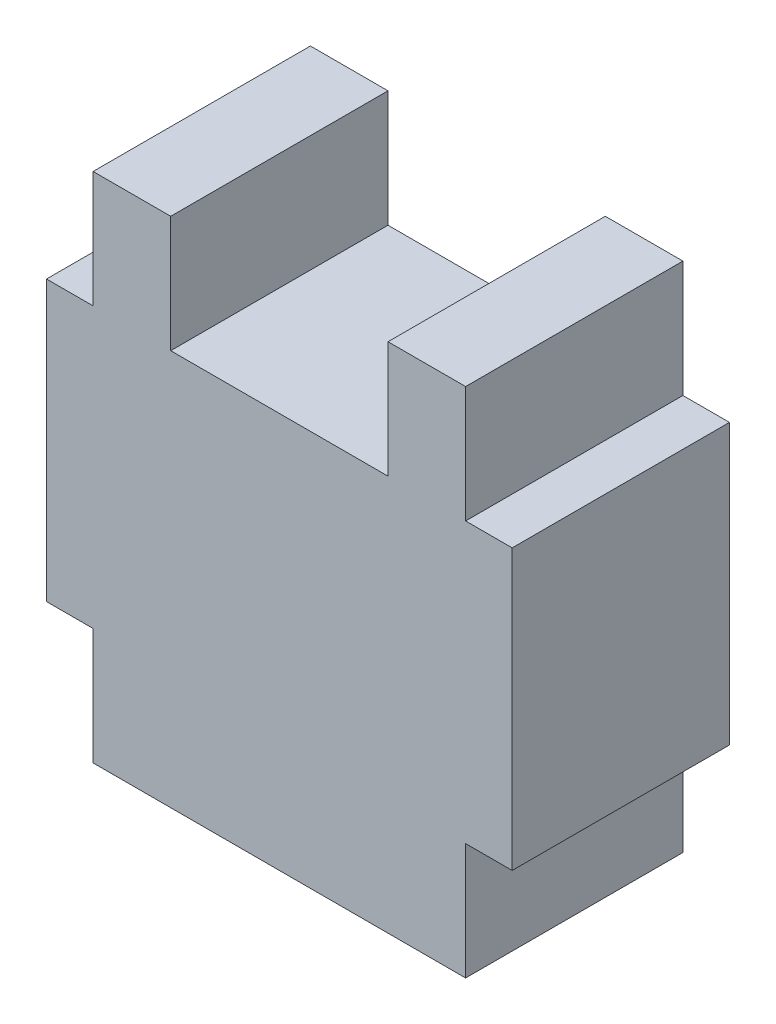
ISO-10303-21;
HEADER;
FILE_DESCRIPTION(('STEP AP214'),'2;1');
FILE_NAME('part.step','',(''),(''),'','','');
FILE_SCHEMA(('AUTOMOTIVE_DESIGN { 1 0 10303 214 1 1 1 1 }'));
ENDSEC;
DATA;
#1=APPLICATION_CONTEXT('core data for automotive mechanical design processes');
#2=APPLICATION_PROTOCOL_DEFINITION('international standard','automotive_design',2000,#1);
#3=PRODUCT_CONTEXT('',#1,'mechanical');
#4=PRODUCT('Part','Part','',(#3));
#5=PRODUCT_RELATED_PRODUCT_CATEGORY('part','',(#4));
#6=PRODUCT_DEFINITION_FORMATION('','',#4);
#7=PRODUCT_DEFINITION_CONTEXT('part definition',#1,'design');
#8=PRODUCT_DEFINITION('design','',#6,#7);
#9=PRODUCT_DEFINITION_SHAPE('','',#8);
#10=(LENGTH_UNIT() NAMED_UNIT(*) SI_UNIT(.MILLI.,.METRE.));
#11=(NAMED_UNIT(*) PLANE_ANGLE_UNIT() SI_UNIT($,.RADIAN.));
#12=(NAMED_UNIT(*) SI_UNIT($,.STERADIAN.) SOLID_ANGLE_UNIT());
#13=UNCERTAINTY_MEASURE_WITH_UNIT(LENGTH_MEASURE(1.E-05),#10,'distance_accuracy_value','');
#14=(GEOMETRIC_REPRESENTATION_CONTEXT(3) GLOBAL_UNCERTAINTY_ASSIGNED_CONTEXT((#13)) GLOBAL_UNIT_ASSIGNED_CONTEXT((#10,
#11,#12)) REPRESENTATION_CONTEXT('',''));
#15=CARTESIAN_POINT('',(0.,0.,0.));
#16=DIRECTION('',(0.,0.,1.));
#17=DIRECTION('',(1.,0.,0.));
#18=AXIS2_PLACEMENT_3D('',#15,#16,#17);
#19=CARTESIAN_POINT('',(1.2,-1.65,1.4));
#20=DIRECTION('',(0.,1.,0.));
#21=DIRECTION('',(0.,0.,1.));
#22=AXIS2_PLACEMENT_3D('',#19,#20,#21);
#23=PLANE('',#22);
#24=DIRECTION('',(1.,0.,0.));
#25=VECTOR('',#24,1.);
#26=CARTESIAN_POINT('',(1.2,-1.65,0.));
#27=LINE('',#26,#25);
#28=CARTESIAN_POINT('',(-1.2,-1.65,0.));
#29=VERTEX_POINT('',#28);
#30=CARTESIAN_POINT('',(1.2,-1.65,0.));
#31=VERTEX_POINT('',#30);
#32=EDGE_CURVE('E178',#29,#31,#27,.T.);
#33=ORIENTED_EDGE('',*,*,#32,.T.);
#34=DIRECTION('',(0.,0.,-1.));
#35=VECTOR('',#34,1.);
#36=CARTESIAN_POINT('',(1.2,-1.65,1.4));
#37=LINE('',#36,#35);
#38=CARTESIAN_POINT('',(1.2,-1.65,1.4));
#39=VERTEX_POINT('',#38);
#40=EDGE_CURVE('E11',#39,#31,#37,.T.);
#41=ORIENTED_EDGE('',*,*,#40,.F.);
#42=DIRECTION('',(1.,0.,0.));
#43=VECTOR('',#42,1.);
#44=CARTESIAN_POINT('',(1.2,-1.65,1.4));
#45=LINE('',#44,#43);
#46=CARTESIAN_POINT('',(-1.2,-1.65,1.4));
#47=VERTEX_POINT('',#46);
#48=EDGE_CURVE('E208',#47,#39,#45,.T.);
#49=ORIENTED_EDGE('',*,*,#48,.F.);
#50=DIRECTION('',(0.,0.,-1.));
#51=VECTOR('',#50,1.);
#52=CARTESIAN_POINT('',(-1.2,-1.65,1.4));
#53=LINE('',#52,#51);
#54=EDGE_CURVE('E174',#47,#29,#53,.T.);
#55=ORIENTED_EDGE('',*,*,#54,.T.);
#56=EDGE_LOOP('',(#33,#41,#49,#55));
#57=FACE_BOUND('',#56,.T.);
#58=ADVANCED_FACE('F34',(#57),#23,.F.);
#59=CARTESIAN_POINT('',(1.2,-0.9,1.4));
#60=DIRECTION('',(-1.,0.,0.));
#61=DIRECTION('',(0.,0.,1.));
#62=AXIS2_PLACEMENT_3D('',#59,#60,#61);
#63=PLANE('',#62);
#64=DIRECTION('',(0.,1.,0.));
#65=VECTOR('',#64,1.);
#66=CARTESIAN_POINT('',(1.2,-0.9,0.));
#67=LINE('',#66,#65);
#68=CARTESIAN_POINT('',(1.2,-0.9,0.));
#69=VERTEX_POINT('',#68);
#70=EDGE_CURVE('E181',#31,#69,#67,.T.);
#71=ORIENTED_EDGE('',*,*,#70,.T.);
#72=DIRECTION('',(0.,0.,-1.));
#73=VECTOR('',#72,1.);
#74=CARTESIAN_POINT('',(1.2,-0.9,1.4));
#75=LINE('',#74,#73);
#76=CARTESIAN_POINT('',(1.2,-0.9,1.4));
#77=VERTEX_POINT('',#76);
#78=EDGE_CURVE('E42',#77,#69,#75,.T.);
#79=ORIENTED_EDGE('',*,*,#78,.F.);
#80=DIRECTION('',(0.,1.,0.));
#81=VECTOR('',#80,1.);
#82=CARTESIAN_POINT('',(1.2,-0.9,1.4));
#83=LINE('',#82,#81);
#84=EDGE_CURVE('E117',#39,#77,#83,.T.);
#85=ORIENTED_EDGE('',*,*,#84,.F.);
#86=ORIENTED_EDGE('',*,*,#40,.T.);
#87=EDGE_LOOP('',(#71,#79,#85,#86));
#88=FACE_BOUND('',#87,.T.);
#89=ADVANCED_FACE('F306',(#88),#63,.F.);
#90=CARTESIAN_POINT('',(1.5,-0.9,1.4));
#91=DIRECTION('',(0.,1.,0.));
#92=DIRECTION('',(0.,0.,1.));
#93=AXIS2_PLACEMENT_3D('',#90,#91,#92);
#94=PLANE('',#93);
#95=DIRECTION('',(1.,0.,0.));
#96=VECTOR('',#95,1.);
#97=CARTESIAN_POINT('',(1.5,-0.9,0.));
#98=LINE('',#97,#96);
#99=CARTESIAN_POINT('',(1.5,-0.9,0.));
#100=VERTEX_POINT('',#99);
#101=EDGE_CURVE('E183',#69,#100,#98,.T.);
#102=ORIENTED_EDGE('',*,*,#101,.T.);
#103=DIRECTION('',(0.,0.,-1.));
#104=VECTOR('',#103,1.);
#105=CARTESIAN_POINT('',(1.5,-0.9,1.4));
#106=LINE('',#105,#104);
#107=CARTESIAN_POINT('',(1.5,-0.9,1.4));
#108=VERTEX_POINT('',#107);
#109=EDGE_CURVE('E239',#108,#100,#106,.T.);
#110=ORIENTED_EDGE('',*,*,#109,.F.);
#111=DIRECTION('',(1.,0.,0.));
#112=VECTOR('',#111,1.);
#113=CARTESIAN_POINT('',(1.5,-0.9,1.4));
#114=LINE('',#113,#112);
#115=EDGE_CURVE('E247',#77,#108,#114,.T.);
#116=ORIENTED_EDGE('',*,*,#115,.F.);
#117=ORIENTED_EDGE('',*,*,#78,.T.);
#118=EDGE_LOOP('',(#102,#110,#116,#117));
#119=FACE_BOUND('',#118,.T.);
#120=ADVANCED_FACE('F245',(#119),#94,.F.);
#121=CARTESIAN_POINT('',(1.5,0.9,1.4));
#122=DIRECTION('',(-1.,0.,0.));
#123=DIRECTION('',(0.,0.,1.));
#124=AXIS2_PLACEMENT_3D('',#121,#122,#123);
#125=PLANE('',#124);
#126=DIRECTION('',(0.,1.,0.));
#127=VECTOR('',#126,1.);
#128=CARTESIAN_POINT('',(1.5,0.9,0.));
#129=LINE('',#128,#127);
#130=CARTESIAN_POINT('',(1.5,0.9,0.));
#131=VERTEX_POINT('',#130);
#132=EDGE_CURVE('E185',#100,#131,#129,.T.);
#133=ORIENTED_EDGE('',*,*,#132,.T.);
#134=DIRECTION('',(0.,0.,-1.));
#135=VECTOR('',#134,1.);
#136=CARTESIAN_POINT('',(1.5,0.9,1.4));
#137=LINE('',#136,#135);
#138=CARTESIAN_POINT('',(1.5,0.9,1.4));
#139=VERTEX_POINT('',#138);
#140=EDGE_CURVE('E236',#139,#131,#137,.T.);
#141=ORIENTED_EDGE('',*,*,#140,.F.);
#142=DIRECTION('',(0.,1.,0.));
#143=VECTOR('',#142,1.);
#144=CARTESIAN_POINT('',(1.5,0.9,1.4));
#145=LINE('',#144,#143);
#146=EDGE_CURVE('E265',#108,#139,#145,.T.);
#147=ORIENTED_EDGE('',*,*,#146,.F.);
#148=ORIENTED_EDGE('',*,*,#109,.T.);
#149=EDGE_LOOP('',(#133,#141,#147,#148));
#150=FACE_BOUND('',#149,.T.);
#151=ADVANCED_FACE('F256',(#150),#125,.F.);
#152=CARTESIAN_POINT('',(1.2,0.9,1.4));
#153=DIRECTION('',(0.,-1.,0.));
#154=DIRECTION('',(0.,0.,-1.));
#155=AXIS2_PLACEMENT_3D('',#152,#153,#154);
#156=PLANE('',#155);
#157=DIRECTION('',(-1.,0.,0.));
#158=VECTOR('',#157,1.);
#159=CARTESIAN_POINT('',(1.2,0.9,0.));
#160=LINE('',#159,#158);
#161=CARTESIAN_POINT('',(1.2,0.9,0.));
#162=VERTEX_POINT('',#161);
#163=EDGE_CURVE('E187',#131,#162,#160,.T.);
#164=ORIENTED_EDGE('',*,*,#163,.T.);
#165=DIRECTION('',(0.,0.,-1.));
#166=VECTOR('',#165,1.);
#167=CARTESIAN_POINT('',(1.2,0.9,1.4));
#168=LINE('',#167,#166);
#169=CARTESIAN_POINT('',(1.2,0.9,1.4));
#170=VERTEX_POINT('',#169);
#171=EDGE_CURVE('E233',#170,#162,#168,.T.);
#172=ORIENTED_EDGE('',*,*,#171,.F.);
#173=DIRECTION('',(-1.,0.,0.));
#174=VECTOR('',#173,1.);
#175=CARTESIAN_POINT('',(1.2,0.9,1.4));
#176=LINE('',#175,#174);
#177=EDGE_CURVE('E262',#139,#170,#176,.T.);
#178=ORIENTED_EDGE('',*,*,#177,.F.);
#179=ORIENTED_EDGE('',*,*,#140,.T.);
#180=EDGE_LOOP('',(#164,#172,#178,#179));
#181=FACE_BOUND('',#180,.T.);
#182=ADVANCED_FACE('F260',(#181),#156,.F.);
#183=CARTESIAN_POINT('',(1.2,1.65,1.4));
#184=DIRECTION('',(-1.,0.,0.));
#185=DIRECTION('',(0.,0.,1.));
#186=AXIS2_PLACEMENT_3D('',#183,#184,#185);
#187=PLANE('',#186);
#188=DIRECTION('',(0.,1.,0.));
#189=VECTOR('',#188,1.);
#190=CARTESIAN_POINT('',(1.2,1.65,0.));
#191=LINE('',#190,#189);
#192=CARTESIAN_POINT('',(1.2,1.65,0.));
#193=VERTEX_POINT('',#192);
#194=EDGE_CURVE('E189',#162,#193,#191,.T.);
#195=ORIENTED_EDGE('',*,*,#194,.T.);
#196=DIRECTION('',(0.,0.,-1.));
#197=VECTOR('',#196,1.);
#198=CARTESIAN_POINT('',(1.2,1.65,1.4));
#199=LINE('',#198,#197);
#200=CARTESIAN_POINT('',(1.2,1.65,1.4));
#201=VERTEX_POINT('',#200);
#202=EDGE_CURVE('E230',#201,#193,#199,.T.);
#203=ORIENTED_EDGE('',*,*,#202,.F.);
#204=DIRECTION('',(0.,1.,0.));
#205=VECTOR('',#204,1.);
#206=CARTESIAN_POINT('',(1.2,1.65,1.4));
#207=LINE('',#206,#205);
#208=EDGE_CURVE('E264',#170,#201,#207,.T.);
#209=ORIENTED_EDGE('',*,*,#208,.F.);
#210=ORIENTED_EDGE('',*,*,#171,.T.);
#211=EDGE_LOOP('',(#195,#203,#209,#210));
#212=FACE_BOUND('',#211,.T.);
#213=ADVANCED_FACE('F319',(#212),#187,.F.);
#214=CARTESIAN_POINT('',(0.7,1.65,1.4));
#215=DIRECTION('',(0.,-1.,0.));
#216=DIRECTION('',(0.,0.,-1.));
#217=AXIS2_PLACEMENT_3D('',#214,#215,#216);
#218=PLANE('',#217);
#219=DIRECTION('',(-1.,0.,0.));
#220=VECTOR('',#219,1.);
#221=CARTESIAN_POINT('',(0.7,1.65,0.));
#222=LINE('',#221,#220);
#223=CARTESIAN_POINT('',(0.7,1.65,0.));
#224=VERTEX_POINT('',#223);
#225=EDGE_CURVE('E191',#193,#224,#222,.T.);
#226=ORIENTED_EDGE('',*,*,#225,.T.);
#227=DIRECTION('',(0.,0.,-1.));
#228=VECTOR('',#227,1.);
#229=CARTESIAN_POINT('',(0.7,1.65,1.4));
#230=LINE('',#229,#228);
#231=CARTESIAN_POINT('',(0.7,1.65,1.4));
#232=VERTEX_POINT('',#231);
#233=EDGE_CURVE('E227',#232,#224,#230,.T.);
#234=ORIENTED_EDGE('',*,*,#233,.F.);
#235=DIRECTION('',(-1.,0.,0.));
#236=VECTOR('',#235,1.);
#237=CARTESIAN_POINT('',(0.7,1.65,1.4));
#238=LINE('',#237,#236);
#239=EDGE_CURVE('E267',#201,#232,#238,.T.);
#240=ORIENTED_EDGE('',*,*,#239,.F.);
#241=ORIENTED_EDGE('',*,*,#202,.T.);
#242=EDGE_LOOP('',(#226,#234,#240,#241));
#243=FACE_BOUND('',#242,.T.);
#244=ADVANCED_FACE('F322',(#243),#218,.F.);
#245=CARTESIAN_POINT('',(0.7,0.9,1.4));
#246=DIRECTION('',(1.,0.,0.));
#247=DIRECTION('',(0.,0.,-1.));
#248=AXIS2_PLACEMENT_3D('',#245,#246,#247);
#249=PLANE('',#248);
#250=DIRECTION('',(0.,-1.,0.));
#251=VECTOR('',#250,1.);
#252=CARTESIAN_POINT('',(0.7,0.9,0.));
#253=LINE('',#252,#251);
#254=CARTESIAN_POINT('',(0.7,0.9,0.));
#255=VERTEX_POINT('',#254);
#256=EDGE_CURVE('E193',#224,#255,#253,.T.);
#257=ORIENTED_EDGE('',*,*,#256,.T.);
#258=DIRECTION('',(0.,0.,-1.));
#259=VECTOR('',#258,1.);
#260=CARTESIAN_POINT('',(0.7,0.9,1.4));
#261=LINE('',#260,#259);
#262=CARTESIAN_POINT('',(0.7,0.9,1.4));
#263=VERTEX_POINT('',#262);
#264=EDGE_CURVE('E224',#263,#255,#261,.T.);
#265=ORIENTED_EDGE('',*,*,#264,.F.);
#266=DIRECTION('',(0.,-1.,0.));
#267=VECTOR('',#266,1.);
#268=CARTESIAN_POINT('',(0.7,0.9,1.4));
#269=LINE('',#268,#267);
#270=EDGE_CURVE('E273',#232,#263,#269,.T.);
#271=ORIENTED_EDGE('',*,*,#270,.F.);
#272=ORIENTED_EDGE('',*,*,#233,.T.);
#273=EDGE_LOOP('',(#257,#265,#271,#272));
#274=FACE_BOUND('',#273,.T.);
#275=ADVANCED_FACE('F326',(#274),#249,.F.);
#276=CARTESIAN_POINT('',(-0.7,0.9,1.4));
#277=DIRECTION('',(0.,-1.,0.));
#278=DIRECTION('',(0.,0.,-1.));
#279=AXIS2_PLACEMENT_3D('',#276,#277,#278);
#280=PLANE('',#279);
#281=DIRECTION('',(-1.,0.,0.));
#282=VECTOR('',#281,1.);
#283=CARTESIAN_POINT('',(-0.7,0.9,0.));
#284=LINE('',#283,#282);
#285=CARTESIAN_POINT('',(-0.7,0.9,0.));
#286=VERTEX_POINT('',#285);
#287=EDGE_CURVE('E195',#255,#286,#284,.T.);
#288=ORIENTED_EDGE('',*,*,#287,.T.);
#289=DIRECTION('',(0.,0.,-1.));
#290=VECTOR('',#289,1.);
#291=CARTESIAN_POINT('',(-0.7,0.9,1.4));
#292=LINE('',#291,#290);
#293=CARTESIAN_POINT('',(-0.7,0.9,1.4));
#294=VERTEX_POINT('',#293);
#295=EDGE_CURVE('E221',#294,#286,#292,.T.);
#296=ORIENTED_EDGE('',*,*,#295,.F.);
#297=DIRECTION('',(-1.,0.,0.));
#298=VECTOR('',#297,1.);
#299=CARTESIAN_POINT('',(-0.7,0.9,1.4));
#300=LINE('',#299,#298);
#301=EDGE_CURVE('E275',#263,#294,#300,.T.);
#302=ORIENTED_EDGE('',*,*,#301,.F.);
#303=ORIENTED_EDGE('',*,*,#264,.T.);
#304=EDGE_LOOP('',(#288,#296,#302,#303));
#305=FACE_BOUND('',#304,.T.);
#306=ADVANCED_FACE('F330',(#305),#280,.F.);
#307=CARTESIAN_POINT('',(-0.7,1.65,1.4));
#308=DIRECTION('',(-1.,0.,0.));
#309=DIRECTION('',(0.,0.,1.));
#310=AXIS2_PLACEMENT_3D('',#307,#308,#309);
#311=PLANE('',#310);
#312=DIRECTION('',(0.,1.,0.));
#313=VECTOR('',#312,1.);
#314=CARTESIAN_POINT('',(-0.7,1.65,0.));
#315=LINE('',#314,#313);
#316=CARTESIAN_POINT('',(-0.7,1.65,0.));
#317=VERTEX_POINT('',#316);
#318=EDGE_CURVE('E197',#286,#317,#315,.T.);
#319=ORIENTED_EDGE('',*,*,#318,.T.);
#320=DIRECTION('',(0.,0.,-1.));
#321=VECTOR('',#320,1.);
#322=CARTESIAN_POINT('',(-0.7,1.65,1.4));
#323=LINE('',#322,#321);
#324=CARTESIAN_POINT('',(-0.7,1.65,1.4));
#325=VERTEX_POINT('',#324);
#326=EDGE_CURVE('E218',#325,#317,#323,.T.);
#327=ORIENTED_EDGE('',*,*,#326,.F.);
#328=DIRECTION('',(0.,1.,0.));
#329=VECTOR('',#328,1.);
#330=CARTESIAN_POINT('',(-0.7,1.65,1.4));
#331=LINE('',#330,#329);
#332=EDGE_CURVE('E277',#294,#325,#331,.T.);
#333=ORIENTED_EDGE('',*,*,#332,.F.);
#334=ORIENTED_EDGE('',*,*,#295,.T.);
#335=EDGE_LOOP('',(#319,#327,#333,#334));
#336=FACE_BOUND('',#335,.T.);
#337=ADVANCED_FACE('F334',(#336),#311,.F.);
#338=CARTESIAN_POINT('',(-1.2,1.65,1.4));
#339=DIRECTION('',(0.,-1.,0.));
#340=DIRECTION('',(0.,0.,-1.));
#341=AXIS2_PLACEMENT_3D('',#338,#339,#340);
#342=PLANE('',#341);
#343=DIRECTION('',(-1.,0.,0.));
#344=VECTOR('',#343,1.);
#345=CARTESIAN_POINT('',(-1.2,1.65,0.));
#346=LINE('',#345,#344);
#347=CARTESIAN_POINT('',(-1.2,1.65,0.));
#348=VERTEX_POINT('',#347);
#349=EDGE_CURVE('E199',#317,#348,#346,.T.);
#350=ORIENTED_EDGE('',*,*,#349,.T.);
#351=DIRECTION('',(0.,0.,-1.));
#352=VECTOR('',#351,1.);
#353=CARTESIAN_POINT('',(-1.2,1.65,1.4));
#354=LINE('',#353,#352);
#355=CARTESIAN_POINT('',(-1.2,1.65,1.4));
#356=VERTEX_POINT('',#355);
#357=EDGE_CURVE('E215',#356,#348,#354,.T.);
#358=ORIENTED_EDGE('',*,*,#357,.F.);
#359=DIRECTION('',(-1.,0.,0.));
#360=VECTOR('',#359,1.);
#361=CARTESIAN_POINT('',(-1.2,1.65,1.4));
#362=LINE('',#361,#360);
#363=EDGE_CURVE('E279',#325,#356,#362,.T.);
#364=ORIENTED_EDGE('',*,*,#363,.F.);
#365=ORIENTED_EDGE('',*,*,#326,.T.);
#366=EDGE_LOOP('',(#350,#358,#364,#365));
#367=FACE_BOUND('',#366,.T.);
#368=ADVANCED_FACE('F338',(#367),#342,.F.);
#369=CARTESIAN_POINT('',(-1.2,0.9,1.4));
#370=DIRECTION('',(1.,0.,0.));
#371=DIRECTION('',(0.,0.,-1.));
#372=AXIS2_PLACEMENT_3D('',#369,#370,#371);
#373=PLANE('',#372);
#374=DIRECTION('',(0.,-1.,0.));
#375=VECTOR('',#374,1.);
#376=CARTESIAN_POINT('',(-1.2,0.9,0.));
#377=LINE('',#376,#375);
#378=CARTESIAN_POINT('',(-1.2,0.9,0.));
#379=VERTEX_POINT('',#378);
#380=EDGE_CURVE('E201',#348,#379,#377,.T.);
#381=ORIENTED_EDGE('',*,*,#380,.T.);
#382=DIRECTION('',(0.,0.,-1.));
#383=VECTOR('',#382,1.);
#384=CARTESIAN_POINT('',(-1.2,0.9,1.4));
#385=LINE('',#384,#383);
#386=CARTESIAN_POINT('',(-1.2,0.9,1.4));
#387=VERTEX_POINT('',#386);
#388=EDGE_CURVE('E212',#387,#379,#385,.T.);
#389=ORIENTED_EDGE('',*,*,#388,.F.);
#390=DIRECTION('',(0.,-1.,0.));
#391=VECTOR('',#390,1.);
#392=CARTESIAN_POINT('',(-1.2,0.9,1.4));
#393=LINE('',#392,#391);
#394=EDGE_CURVE('E281',#356,#387,#393,.T.);
#395=ORIENTED_EDGE('',*,*,#394,.F.);
#396=ORIENTED_EDGE('',*,*,#357,.T.);
#397=EDGE_LOOP('',(#381,#389,#395,#396));
#398=FACE_BOUND('',#397,.T.);
#399=ADVANCED_FACE('F287',(#398),#373,.F.);
#400=CARTESIAN_POINT('',(-1.5,0.9,1.4));
#401=DIRECTION('',(0.,-1.,0.));
#402=DIRECTION('',(0.,0.,-1.));
#403=AXIS2_PLACEMENT_3D('',#400,#401,#402);
#404=PLANE('',#403);
#405=DIRECTION('',(-1.,0.,0.));
#406=VECTOR('',#405,1.);
#407=CARTESIAN_POINT('',(-1.5,0.9,0.));
#408=LINE('',#407,#406);
#409=CARTESIAN_POINT('',(-1.5,0.9,0.));
#410=VERTEX_POINT('',#409);
#411=EDGE_CURVE('E203',#379,#410,#408,.T.);
#412=ORIENTED_EDGE('',*,*,#411,.T.);
#413=DIRECTION('',(0.,0.,-1.));
#414=VECTOR('',#413,1.);
#415=CARTESIAN_POINT('',(-1.5,0.9,1.4));
#416=LINE('',#415,#414);
#417=CARTESIAN_POINT('',(-1.5,0.9,1.4));
#418=VERTEX_POINT('',#417);
#419=EDGE_CURVE('E169',#418,#410,#416,.T.);
#420=ORIENTED_EDGE('',*,*,#419,.F.);
#421=DIRECTION('',(-1.,0.,0.));
#422=VECTOR('',#421,1.);
#423=CARTESIAN_POINT('',(-1.5,0.9,1.4));
#424=LINE('',#423,#422);
#425=EDGE_CURVE('E160',#387,#418,#424,.T.);
#426=ORIENTED_EDGE('',*,*,#425,.F.);
#427=ORIENTED_EDGE('',*,*,#388,.T.);
#428=EDGE_LOOP('',(#412,#420,#426,#427));
#429=FACE_BOUND('',#428,.T.);
#430=ADVANCED_FACE('F291',(#429),#404,.F.);
#431=CARTESIAN_POINT('',(-1.5,-0.9,1.4));
#432=DIRECTION('',(1.,0.,0.));
#433=DIRECTION('',(0.,0.,-1.));
#434=AXIS2_PLACEMENT_3D('',#431,#432,#433);
#435=PLANE('',#434);
#436=DIRECTION('',(0.,-1.,0.));
#437=VECTOR('',#436,1.);
#438=CARTESIAN_POINT('',(-1.5,-0.9,0.));
#439=LINE('',#438,#437);
#440=CARTESIAN_POINT('',(-1.5,-0.9,0.));
#441=VERTEX_POINT('',#440);
#442=EDGE_CURVE('E168',#410,#441,#439,.T.);
#443=ORIENTED_EDGE('',*,*,#442,.T.);
#444=DIRECTION('',(0.,0.,-1.));
#445=VECTOR('',#444,1.);
#446=CARTESIAN_POINT('',(-1.5,-0.9,1.4));
#447=LINE('',#446,#445);
#448=CARTESIAN_POINT('',(-1.5,-0.9,1.4));
#449=VERTEX_POINT('',#448);
#450=EDGE_CURVE('E165',#449,#441,#447,.T.);
#451=ORIENTED_EDGE('',*,*,#450,.F.);
#452=DIRECTION('',(0.,-1.,0.));
#453=VECTOR('',#452,1.);
#454=CARTESIAN_POINT('',(-1.5,-0.9,1.4));
#455=LINE('',#454,#453);
#456=EDGE_CURVE('E154',#418,#449,#455,.T.);
#457=ORIENTED_EDGE('',*,*,#456,.F.);
#458=ORIENTED_EDGE('',*,*,#419,.T.);
#459=EDGE_LOOP('',(#443,#451,#457,#458));
#460=FACE_BOUND('',#459,.T.);
#461=ADVANCED_FACE('F166',(#460),#435,.F.);
#462=CARTESIAN_POINT('',(-1.2,-0.9,1.4));
#463=DIRECTION('',(0.,1.,0.));
#464=DIRECTION('',(0.,0.,1.));
#465=AXIS2_PLACEMENT_3D('',#462,#463,#464);
#466=PLANE('',#465);
#467=DIRECTION('',(1.,0.,0.));
#468=VECTOR('',#467,1.);
#469=CARTESIAN_POINT('',(-1.2,-0.9,0.));
#470=LINE('',#469,#468);
#471=CARTESIAN_POINT('',(-1.2,-0.9,0.));
#472=VERTEX_POINT('',#471);
#473=EDGE_CURVE('E103',#441,#472,#470,.T.);
#474=ORIENTED_EDGE('',*,*,#473,.T.);
#475=DIRECTION('',(0.,0.,-1.));
#476=VECTOR('',#475,1.);
#477=CARTESIAN_POINT('',(-1.2,-0.9,1.4));
#478=LINE('',#477,#476);
#479=CARTESIAN_POINT('',(-1.2,-0.9,1.4));
#480=VERTEX_POINT('',#479);
#481=EDGE_CURVE('E170',#480,#472,#478,.T.);
#482=ORIENTED_EDGE('',*,*,#481,.F.);
#483=DIRECTION('',(1.,0.,0.));
#484=VECTOR('',#483,1.);
#485=CARTESIAN_POINT('',(-1.2,-0.9,1.4));
#486=LINE('',#485,#484);
#487=EDGE_CURVE('E158',#449,#480,#486,.T.);
#488=ORIENTED_EDGE('',*,*,#487,.F.);
#489=ORIENTED_EDGE('',*,*,#450,.T.);
#490=EDGE_LOOP('',(#474,#482,#488,#489));
#491=FACE_BOUND('',#490,.T.);
#492=ADVANCED_FACE('F172',(#491),#466,.F.);
#493=CARTESIAN_POINT('',(-1.2,-1.65,1.4));
#494=DIRECTION('',(1.,0.,0.));
#495=DIRECTION('',(0.,0.,-1.));
#496=AXIS2_PLACEMENT_3D('',#493,#494,#495);
#497=PLANE('',#496);
#498=DIRECTION('',(0.,-1.,0.));
#499=VECTOR('',#498,1.);
#500=CARTESIAN_POINT('',(-1.2,-1.65,0.));
#501=LINE('',#500,#499);
#502=EDGE_CURVE('E109',#472,#29,#501,.T.);
#503=ORIENTED_EDGE('',*,*,#502,.T.);
#504=ORIENTED_EDGE('',*,*,#54,.F.);
#505=DIRECTION('',(0.,-1.,0.));
#506=VECTOR('',#505,1.);
#507=CARTESIAN_POINT('',(-1.2,-1.65,1.4));
#508=LINE('',#507,#506);
#509=EDGE_CURVE('E50',#480,#47,#508,.T.);
#510=ORIENTED_EDGE('',*,*,#509,.F.);
#511=ORIENTED_EDGE('',*,*,#481,.T.);
#512=EDGE_LOOP('',(#503,#504,#510,#511));
#513=FACE_BOUND('',#512,.T.);
#514=ADVANCED_FACE('F295',(#513),#497,.F.);
#515=CARTESIAN_POINT('',(0.,0.,1.4));
#516=DIRECTION('',(0.,0.,-1.));
#517=DIRECTION('',(-1.,0.,0.));
#518=AXIS2_PLACEMENT_3D('',#515,#516,#517);
#519=PLANE('',#518);
#520=ORIENTED_EDGE('',*,*,#48,.T.);
#521=ORIENTED_EDGE('',*,*,#84,.T.);
#522=ORIENTED_EDGE('',*,*,#115,.T.);
#523=ORIENTED_EDGE('',*,*,#146,.T.);
#524=ORIENTED_EDGE('',*,*,#177,.T.);
#525=ORIENTED_EDGE('',*,*,#208,.T.);
#526=ORIENTED_EDGE('',*,*,#239,.T.);
#527=ORIENTED_EDGE('',*,*,#270,.T.);
#528=ORIENTED_EDGE('',*,*,#301,.T.);
#529=ORIENTED_EDGE('',*,*,#332,.T.);
#530=ORIENTED_EDGE('',*,*,#363,.T.);
#531=ORIENTED_EDGE('',*,*,#394,.T.);
#532=ORIENTED_EDGE('',*,*,#425,.T.);
#533=ORIENTED_EDGE('',*,*,#456,.T.);
#534=ORIENTED_EDGE('',*,*,#487,.T.);
#535=ORIENTED_EDGE('',*,*,#509,.T.);
#536=EDGE_LOOP('',(#520,#521,#522,#523,#524,#525,#526,#527,#528,#529,#530,#531,#532,#533,#534,#535));
#537=FACE_BOUND('',#536,.T.);
#538=ADVANCED_FACE('F156',(#537),#519,.F.);
#539=CARTESIAN_POINT('',(0.,0.,0.));
#540=DIRECTION('',(0.,0.,-1.));
#541=DIRECTION('',(-1.,0.,0.));
#542=AXIS2_PLACEMENT_3D('',#539,#540,#541);
#543=PLANE('',#542);
#544=ORIENTED_EDGE('',*,*,#32,.F.);
#545=ORIENTED_EDGE('',*,*,#502,.F.);
#546=ORIENTED_EDGE('',*,*,#473,.F.);
#547=ORIENTED_EDGE('',*,*,#442,.F.);
#548=ORIENTED_EDGE('',*,*,#411,.F.);
#549=ORIENTED_EDGE('',*,*,#380,.F.);
#550=ORIENTED_EDGE('',*,*,#349,.F.);
#551=ORIENTED_EDGE('',*,*,#318,.F.);
#552=ORIENTED_EDGE('',*,*,#287,.F.);
#553=ORIENTED_EDGE('',*,*,#256,.F.);
#554=ORIENTED_EDGE('',*,*,#225,.F.);
#555=ORIENTED_EDGE('',*,*,#194,.F.);
#556=ORIENTED_EDGE('',*,*,#163,.F.);
#557=ORIENTED_EDGE('',*,*,#132,.F.);
#558=ORIENTED_EDGE('',*,*,#101,.F.);
#559=ORIENTED_EDGE('',*,*,#70,.F.);
#560=EDGE_LOOP('',(#544,#545,#546,#547,#548,#549,#550,#551,#552,#553,#554,#555,#556,#557,#558,#559));
#561=FACE_BOUND('',#560,.T.);
#562=ADVANCED_FACE('F251',(#561),#543,.T.);
#563=CLOSED_SHELL('',(#58,#89,#120,#151,#182,#213,#244,#275,#306,#337,#368,#399,#430,#461,#492,
#514,#538,#562));
#564=MANIFOLD_SOLID_BREP('B2',#563);
#565=ADVANCED_BREP_SHAPE_REPRESENTATION('',(#18,#564),#14);
#566=SHAPE_DEFINITION_REPRESENTATION(#9,#565);
ENDSEC;
END-ISO-10303-21;
